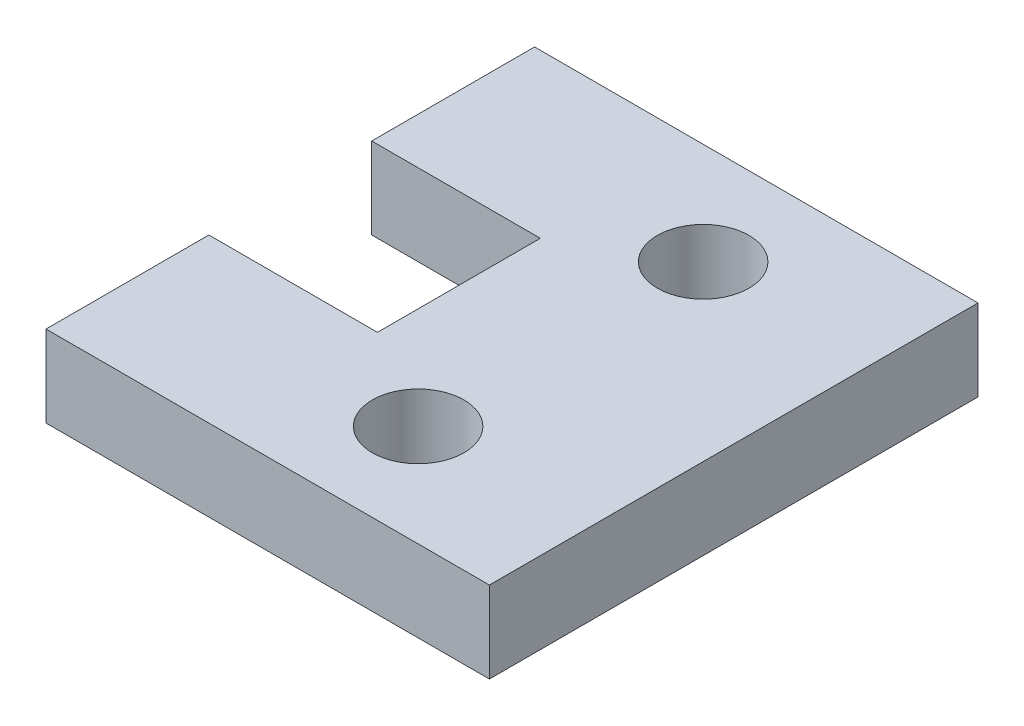
ISO-10303-21;
HEADER;
FILE_DESCRIPTION(('STEP AP214'),'2;1');
FILE_NAME('part.step','',(''),(''),'','','');
FILE_SCHEMA(('AUTOMOTIVE_DESIGN { 1 0 10303 214 1 1 1 1 }'));
ENDSEC;
DATA;
#1=APPLICATION_CONTEXT('core data for automotive mechanical design processes');
#2=APPLICATION_PROTOCOL_DEFINITION('international standard','automotive_design',2000,#1);
#3=PRODUCT_CONTEXT('',#1,'mechanical');
#4=PRODUCT('Part','Part','',(#3));
#5=PRODUCT_RELATED_PRODUCT_CATEGORY('part','',(#4));
#6=PRODUCT_DEFINITION_FORMATION('','',#4);
#7=PRODUCT_DEFINITION_CONTEXT('part definition',#1,'design');
#8=PRODUCT_DEFINITION('design','',#6,#7);
#9=PRODUCT_DEFINITION_SHAPE('','',#8);
#10=(LENGTH_UNIT() NAMED_UNIT(*) SI_UNIT(.MILLI.,.METRE.));
#11=(NAMED_UNIT(*) PLANE_ANGLE_UNIT() SI_UNIT($,.RADIAN.));
#12=(NAMED_UNIT(*) SI_UNIT($,.STERADIAN.) SOLID_ANGLE_UNIT());
#13=UNCERTAINTY_MEASURE_WITH_UNIT(LENGTH_MEASURE(1.E-05),#10,'distance_accuracy_value','');
#14=(GEOMETRIC_REPRESENTATION_CONTEXT(3) GLOBAL_UNCERTAINTY_ASSIGNED_CONTEXT((#13)) GLOBAL_UNIT_ASSIGNED_CONTEXT((#10,
#11,#12)) REPRESENTATION_CONTEXT('',''));
#15=CARTESIAN_POINT('',(0.,0.,0.));
#16=DIRECTION('',(0.,0.,1.));
#17=DIRECTION('',(1.,0.,0.));
#18=AXIS2_PLACEMENT_3D('',#15,#16,#17);
#19=CARTESIAN_POINT('',(-5.,4.,0.));
#20=DIRECTION('',(-1.,0.,0.));
#21=DIRECTION('',(0.,0.,1.));
#22=AXIS2_PLACEMENT_3D('',#19,#20,#21);
#23=PLANE('',#22);
#24=DIRECTION('',(0.,0.,-1.));
#25=VECTOR('',#24,1.);
#26=CARTESIAN_POINT('',(-5.,0.,0.));
#27=LINE('',#26,#25);
#28=CARTESIAN_POINT('',(-5.,0.,4.));
#29=VERTEX_POINT('',#28);
#30=CARTESIAN_POINT('',(-5.,0.,-4.));
#31=VERTEX_POINT('',#30);
#32=EDGE_CURVE('E155',#29,#31,#27,.T.);
#33=ORIENTED_EDGE('',*,*,#32,.F.);
#34=DIRECTION('',(0.,-1.,0.));
#35=VECTOR('',#34,1.);
#36=CARTESIAN_POINT('',(-5.,4.,4.));
#37=LINE('',#36,#35);
#38=CARTESIAN_POINT('',(-5.,4.,4.));
#39=VERTEX_POINT('',#38);
#40=EDGE_CURVE('E11',#39,#29,#37,.T.);
#41=ORIENTED_EDGE('',*,*,#40,.F.);
#42=DIRECTION('',(0.,0.,-1.));
#43=VECTOR('',#42,1.);
#44=CARTESIAN_POINT('',(-5.,4.,0.));
#45=LINE('',#44,#43);
#46=CARTESIAN_POINT('',(-5.,4.,-4.));
#47=VERTEX_POINT('',#46);
#48=EDGE_CURVE('E185',#39,#47,#45,.T.);
#49=ORIENTED_EDGE('',*,*,#48,.T.);
#50=DIRECTION('',(0.,-1.,0.));
#51=VECTOR('',#50,1.);
#52=CARTESIAN_POINT('',(-5.,4.,-4.));
#53=LINE('',#52,#51);
#54=EDGE_CURVE('E100',#47,#31,#53,.T.);
#55=ORIENTED_EDGE('',*,*,#54,.T.);
#56=EDGE_LOOP('',(#33,#41,#49,#55));
#57=FACE_BOUND('',#56,.T.);
#58=ADVANCED_FACE('F41',(#57),#23,.T.);
#59=CARTESIAN_POINT('',(0.,4.,4.));
#60=DIRECTION('',(0.,0.,1.));
#61=DIRECTION('',(1.,0.,0.));
#62=AXIS2_PLACEMENT_3D('',#59,#60,#61);
#63=PLANE('',#62);
#64=DIRECTION('',(-1.,0.,0.));
#65=VECTOR('',#64,1.);
#66=CARTESIAN_POINT('',(0.,0.,4.));
#67=LINE('',#66,#65);
#68=CARTESIAN_POINT('',(-13.2799459906607,0.,4.));
#69=VERTEX_POINT('',#68);
#70=EDGE_CURVE('E158',#29,#69,#67,.T.);
#71=ORIENTED_EDGE('',*,*,#70,.T.);
#72=DIRECTION('',(0.,-1.,0.));
#73=VECTOR('',#72,1.);
#74=CARTESIAN_POINT('',(-13.2799459906607,4.,4.));
#75=LINE('',#74,#73);
#76=CARTESIAN_POINT('',(-13.2799459906607,4.,4.));
#77=VERTEX_POINT('',#76);
#78=EDGE_CURVE('E49',#77,#69,#75,.T.);
#79=ORIENTED_EDGE('',*,*,#78,.F.);
#80=DIRECTION('',(-1.,0.,0.));
#81=VECTOR('',#80,1.);
#82=CARTESIAN_POINT('',(0.,4.,4.));
#83=LINE('',#82,#81);
#84=EDGE_CURVE('E221',#39,#77,#83,.T.);
#85=ORIENTED_EDGE('',*,*,#84,.F.);
#86=ORIENTED_EDGE('',*,*,#40,.T.);
#87=EDGE_LOOP('',(#71,#79,#85,#86));
#88=FACE_BOUND('',#87,.T.);
#89=ADVANCED_FACE('F226',(#88),#63,.F.);
#90=CARTESIAN_POINT('',(-13.2799459906607,4.,0.));
#91=DIRECTION('',(1.,0.,0.));
#92=DIRECTION('',(0.,0.,-1.));
#93=AXIS2_PLACEMENT_3D('',#90,#91,#92);
#94=PLANE('',#93);
#95=DIRECTION('',(0.,0.,1.));
#96=VECTOR('',#95,1.);
#97=CARTESIAN_POINT('',(-13.2799459906607,0.,0.));
#98=LINE('',#97,#96);
#99=CARTESIAN_POINT('',(-13.2799459906607,0.,12.));
#100=VERTEX_POINT('',#99);
#101=EDGE_CURVE('E160',#69,#100,#98,.T.);
#102=ORIENTED_EDGE('',*,*,#101,.T.);
#103=DIRECTION('',(0.,-1.,0.));
#104=VECTOR('',#103,1.);
#105=CARTESIAN_POINT('',(-13.2799459906607,4.,12.));
#106=LINE('',#105,#104);
#107=CARTESIAN_POINT('',(-13.2799459906607,4.,12.));
#108=VERTEX_POINT('',#107);
#109=EDGE_CURVE('E194',#108,#100,#106,.T.);
#110=ORIENTED_EDGE('',*,*,#109,.F.);
#111=DIRECTION('',(0.,0.,1.));
#112=VECTOR('',#111,1.);
#113=CARTESIAN_POINT('',(-13.2799459906607,4.,0.));
#114=LINE('',#113,#112);
#115=EDGE_CURVE('E204',#77,#108,#114,.T.);
#116=ORIENTED_EDGE('',*,*,#115,.F.);
#117=ORIENTED_EDGE('',*,*,#78,.T.);
#118=EDGE_LOOP('',(#102,#110,#116,#117));
#119=FACE_BOUND('',#118,.T.);
#120=ADVANCED_FACE('F202',(#119),#94,.F.);
#121=CARTESIAN_POINT('',(0.,4.,12.));
#122=DIRECTION('',(0.,0.,-1.));
#123=DIRECTION('',(-1.,0.,0.));
#124=AXIS2_PLACEMENT_3D('',#121,#122,#123);
#125=PLANE('',#124);
#126=DIRECTION('',(1.,0.,0.));
#127=VECTOR('',#126,1.);
#128=CARTESIAN_POINT('',(0.,0.,12.));
#129=LINE('',#128,#127);
#130=CARTESIAN_POINT('',(8.5,0.,12.));
#131=VERTEX_POINT('',#130);
#132=EDGE_CURVE('E163',#100,#131,#129,.T.);
#133=ORIENTED_EDGE('',*,*,#132,.T.);
#134=DIRECTION('',(0.,-1.,0.));
#135=VECTOR('',#134,1.);
#136=CARTESIAN_POINT('',(8.5,4.,12.));
#137=LINE('',#136,#135);
#138=CARTESIAN_POINT('',(8.5,4.,12.));
#139=VERTEX_POINT('',#138);
#140=EDGE_CURVE('E191',#139,#131,#137,.T.);
#141=ORIENTED_EDGE('',*,*,#140,.F.);
#142=DIRECTION('',(1.,0.,0.));
#143=VECTOR('',#142,1.);
#144=CARTESIAN_POINT('',(0.,4.,12.));
#145=LINE('',#144,#143);
#146=EDGE_CURVE('E216',#108,#139,#145,.T.);
#147=ORIENTED_EDGE('',*,*,#146,.F.);
#148=ORIENTED_EDGE('',*,*,#109,.T.);
#149=EDGE_LOOP('',(#133,#141,#147,#148));
#150=FACE_BOUND('',#149,.T.);
#151=ADVANCED_FACE('F214',(#150),#125,.F.);
#152=CARTESIAN_POINT('',(8.5,4.,0.));
#153=DIRECTION('',(1.,0.,0.));
#154=DIRECTION('',(0.,0.,-1.));
#155=AXIS2_PLACEMENT_3D('',#152,#153,#154);
#156=PLANE('',#155);
#157=DIRECTION('',(0.,0.,1.));
#158=VECTOR('',#157,1.);
#159=CARTESIAN_POINT('',(8.5,0.,0.));
#160=LINE('',#159,#158);
#161=CARTESIAN_POINT('',(8.5,0.,-12.));
#162=VERTEX_POINT('',#161);
#163=EDGE_CURVE('E166',#162,#131,#160,.T.);
#164=ORIENTED_EDGE('',*,*,#163,.F.);
#165=DIRECTION('',(0.,-1.,0.));
#166=VECTOR('',#165,1.);
#167=CARTESIAN_POINT('',(8.5,4.,-12.));
#168=LINE('',#167,#166);
#169=CARTESIAN_POINT('',(8.5,4.,-12.));
#170=VERTEX_POINT('',#169);
#171=EDGE_CURVE('E137',#170,#162,#168,.T.);
#172=ORIENTED_EDGE('',*,*,#171,.F.);
#173=DIRECTION('',(0.,0.,1.));
#174=VECTOR('',#173,1.);
#175=CARTESIAN_POINT('',(8.5,4.,0.));
#176=LINE('',#175,#174);
#177=EDGE_CURVE('E128',#170,#139,#176,.T.);
#178=ORIENTED_EDGE('',*,*,#177,.T.);
#179=ORIENTED_EDGE('',*,*,#140,.T.);
#180=EDGE_LOOP('',(#164,#172,#178,#179));
#181=FACE_BOUND('',#180,.T.);
#182=ADVANCED_FACE('F236',(#181),#156,.T.);
#183=CARTESIAN_POINT('',(0.,4.,-12.));
#184=DIRECTION('',(0.,0.,1.));
#185=DIRECTION('',(1.,0.,0.));
#186=AXIS2_PLACEMENT_3D('',#183,#184,#185);
#187=PLANE('',#186);
#188=DIRECTION('',(-1.,0.,0.));
#189=VECTOR('',#188,1.);
#190=CARTESIAN_POINT('',(0.,0.,-12.));
#191=LINE('',#190,#189);
#192=CARTESIAN_POINT('',(-13.2799459906607,0.,-12.));
#193=VERTEX_POINT('',#192);
#194=EDGE_CURVE('E135',#162,#193,#191,.T.);
#195=ORIENTED_EDGE('',*,*,#194,.T.);
#196=DIRECTION('',(0.,-1.,0.));
#197=VECTOR('',#196,1.);
#198=CARTESIAN_POINT('',(-13.2799459906607,4.,-12.));
#199=LINE('',#198,#197);
#200=CARTESIAN_POINT('',(-13.2799459906607,4.,-12.));
#201=VERTEX_POINT('',#200);
#202=EDGE_CURVE('E132',#201,#193,#199,.T.);
#203=ORIENTED_EDGE('',*,*,#202,.F.);
#204=DIRECTION('',(-1.,0.,0.));
#205=VECTOR('',#204,1.);
#206=CARTESIAN_POINT('',(0.,4.,-12.));
#207=LINE('',#206,#205);
#208=EDGE_CURVE('E121',#170,#201,#207,.T.);
#209=ORIENTED_EDGE('',*,*,#208,.F.);
#210=ORIENTED_EDGE('',*,*,#171,.T.);
#211=EDGE_LOOP('',(#195,#203,#209,#210));
#212=FACE_BOUND('',#211,.T.);
#213=ADVANCED_FACE('F133',(#212),#187,.F.);
#214=CARTESIAN_POINT('',(-13.2799459906607,4.,0.));
#215=DIRECTION('',(1.,0.,0.));
#216=DIRECTION('',(0.,0.,-1.));
#217=AXIS2_PLACEMENT_3D('',#214,#215,#216);
#218=PLANE('',#217);
#219=DIRECTION('',(0.,0.,1.));
#220=VECTOR('',#219,1.);
#221=CARTESIAN_POINT('',(-13.2799459906607,0.,0.));
#222=LINE('',#221,#220);
#223=CARTESIAN_POINT('',(-13.2799459906607,0.,-4.));
#224=VERTEX_POINT('',#223);
#225=EDGE_CURVE('E93',#193,#224,#222,.T.);
#226=ORIENTED_EDGE('',*,*,#225,.T.);
#227=DIRECTION('',(0.,-1.,0.));
#228=VECTOR('',#227,1.);
#229=CARTESIAN_POINT('',(-13.2799459906607,4.,-4.));
#230=LINE('',#229,#228);
#231=CARTESIAN_POINT('',(-13.2799459906607,4.,-4.));
#232=VERTEX_POINT('',#231);
#233=EDGE_CURVE('E138',#232,#224,#230,.T.);
#234=ORIENTED_EDGE('',*,*,#233,.F.);
#235=DIRECTION('',(0.,0.,1.));
#236=VECTOR('',#235,1.);
#237=CARTESIAN_POINT('',(-13.2799459906607,4.,0.));
#238=LINE('',#237,#236);
#239=EDGE_CURVE('E126',#201,#232,#238,.T.);
#240=ORIENTED_EDGE('',*,*,#239,.F.);
#241=ORIENTED_EDGE('',*,*,#202,.T.);
#242=EDGE_LOOP('',(#226,#234,#240,#241));
#243=FACE_BOUND('',#242,.T.);
#244=ADVANCED_FACE('F140',(#243),#218,.F.);
#245=CARTESIAN_POINT('',(0.,4.,-7.00000000000125));
#246=DIRECTION('',(0.,-1.,0.));
#247=DIRECTION('',(0.,0.,-1.));
#248=AXIS2_PLACEMENT_3D('',#245,#246,#247);
#249=CYLINDRICAL_SURFACE('',#248,2.25);
#250=CARTESIAN_POINT('',(0.,4.,-7.00000000000125));
#251=DIRECTION('',(0.,1.,0.));
#252=DIRECTION('',(0.,0.,1.));
#253=AXIS2_PLACEMENT_3D('',#250,#251,#252);
#254=CIRCLE('',#253,2.25);
#255=CARTESIAN_POINT('',(0.,4.,-4.75000000000125));
#256=VERTEX_POINT('',#255);
#257=EDGE_CURVE('E145',#256,#256,#254,.T.);
#258=ORIENTED_EDGE('',*,*,#257,.T.);
#259=EDGE_LOOP('',(#258));
#260=FACE_BOUND('',#259,.T.);
#261=CARTESIAN_POINT('',(0.,0.,-7.00000000000125));
#262=DIRECTION('',(0.,1.,0.));
#263=DIRECTION('',(0.,0.,1.));
#264=AXIS2_PLACEMENT_3D('',#261,#262,#263);
#265=CIRCLE('',#264,2.25);
#266=CARTESIAN_POINT('',(0.,0.,-4.75000000000125));
#267=VERTEX_POINT('',#266);
#268=EDGE_CURVE('E177',#267,#267,#265,.T.);
#269=ORIENTED_EDGE('',*,*,#268,.F.);
#270=EDGE_LOOP('',(#269));
#271=FACE_BOUND('',#270,.T.);
#272=ADVANCED_FACE('F244',(#260,#271),#249,.F.);
#273=CARTESIAN_POINT('',(0.,4.,-4.));
#274=DIRECTION('',(0.,0.,-1.));
#275=DIRECTION('',(-1.,0.,0.));
#276=AXIS2_PLACEMENT_3D('',#273,#274,#275);
#277=PLANE('',#276);
#278=DIRECTION('',(1.,0.,0.));
#279=VECTOR('',#278,1.);
#280=CARTESIAN_POINT('',(0.,0.,-4.));
#281=LINE('',#280,#279);
#282=EDGE_CURVE('E174',#224,#31,#281,.T.);
#283=ORIENTED_EDGE('',*,*,#282,.T.);
#284=ORIENTED_EDGE('',*,*,#54,.F.);
#285=DIRECTION('',(1.,0.,0.));
#286=VECTOR('',#285,1.);
#287=CARTESIAN_POINT('',(0.,4.,-4.));
#288=LINE('',#287,#286);
#289=EDGE_CURVE('E60',#232,#47,#288,.T.);
#290=ORIENTED_EDGE('',*,*,#289,.F.);
#291=ORIENTED_EDGE('',*,*,#233,.T.);
#292=EDGE_LOOP('',(#283,#284,#290,#291));
#293=FACE_BOUND('',#292,.T.);
#294=ADVANCED_FACE('F245',(#293),#277,.F.);
#295=CARTESIAN_POINT('',(0.,4.,6.99999999999875));
#296=DIRECTION('',(0.,-1.,0.));
#297=DIRECTION('',(0.,0.,-1.));
#298=AXIS2_PLACEMENT_3D('',#295,#296,#297);
#299=CYLINDRICAL_SURFACE('',#298,2.25);
#300=CARTESIAN_POINT('',(0.,4.,6.99999999999875));
#301=DIRECTION('',(0.,1.,0.));
#302=DIRECTION('',(0.,0.,1.));
#303=AXIS2_PLACEMENT_3D('',#300,#301,#302);
#304=CIRCLE('',#303,2.25);
#305=CARTESIAN_POINT('',(0.,4.,9.24999999999875));
#306=VERTEX_POINT('',#305);
#307=EDGE_CURVE('E152',#306,#306,#304,.T.);
#308=ORIENTED_EDGE('',*,*,#307,.T.);
#309=EDGE_LOOP('',(#308));
#310=FACE_BOUND('',#309,.T.);
#311=CARTESIAN_POINT('',(0.,0.,6.99999999999875));
#312=DIRECTION('',(0.,1.,0.));
#313=DIRECTION('',(0.,0.,1.));
#314=AXIS2_PLACEMENT_3D('',#311,#312,#313);
#315=CIRCLE('',#314,2.25);
#316=CARTESIAN_POINT('',(0.,0.,9.24999999999875));
#317=VERTEX_POINT('',#316);
#318=EDGE_CURVE('E181',#317,#317,#315,.T.);
#319=ORIENTED_EDGE('',*,*,#318,.F.);
#320=EDGE_LOOP('',(#319));
#321=FACE_BOUND('',#320,.T.);
#322=ADVANCED_FACE('F248',(#310,#321),#299,.F.);
#323=CARTESIAN_POINT('',(0.,4.,0.));
#324=DIRECTION('',(0.,1.,0.));
#325=DIRECTION('',(0.,0.,1.));
#326=AXIS2_PLACEMENT_3D('',#323,#324,#325);
#327=PLANE('',#326);
#328=ORIENTED_EDGE('',*,*,#48,.F.);
#329=ORIENTED_EDGE('',*,*,#84,.T.);
#330=ORIENTED_EDGE('',*,*,#115,.T.);
#331=ORIENTED_EDGE('',*,*,#146,.T.);
#332=ORIENTED_EDGE('',*,*,#177,.F.);
#333=ORIENTED_EDGE('',*,*,#208,.T.);
#334=ORIENTED_EDGE('',*,*,#239,.T.);
#335=ORIENTED_EDGE('',*,*,#289,.T.);
#336=EDGE_LOOP('',(#328,#329,#330,#331,#332,#333,#334,#335));
#337=FACE_BOUND('',#336,.T.);
#338=ORIENTED_EDGE('',*,*,#257,.F.);
#339=EDGE_LOOP('',(#338));
#340=FACE_BOUND('',#339,.T.);
#341=ORIENTED_EDGE('',*,*,#307,.F.);
#342=EDGE_LOOP('',(#341));
#343=FACE_BOUND('',#342,.T.);
#344=ADVANCED_FACE('F123',(#337,#340,#343),#327,.T.);
#345=CARTESIAN_POINT('',(0.,0.,0.));
#346=DIRECTION('',(0.,1.,0.));
#347=DIRECTION('',(0.,0.,1.));
#348=AXIS2_PLACEMENT_3D('',#345,#346,#347);
#349=PLANE('',#348);
#350=ORIENTED_EDGE('',*,*,#32,.T.);
#351=ORIENTED_EDGE('',*,*,#282,.F.);
#352=ORIENTED_EDGE('',*,*,#225,.F.);
#353=ORIENTED_EDGE('',*,*,#194,.F.);
#354=ORIENTED_EDGE('',*,*,#163,.T.);
#355=ORIENTED_EDGE('',*,*,#132,.F.);
#356=ORIENTED_EDGE('',*,*,#101,.F.);
#357=ORIENTED_EDGE('',*,*,#70,.F.);
#358=EDGE_LOOP('',(#350,#351,#352,#353,#354,#355,#356,#357));
#359=FACE_BOUND('',#358,.T.);
#360=ORIENTED_EDGE('',*,*,#268,.T.);
#361=EDGE_LOOP('',(#360));
#362=FACE_BOUND('',#361,.T.);
#363=ORIENTED_EDGE('',*,*,#318,.T.);
#364=EDGE_LOOP('',(#363));
#365=FACE_BOUND('',#364,.T.);
#366=ADVANCED_FACE('F209',(#359,#362,#365),#349,.F.);
#367=CLOSED_SHELL('',(#58,#89,#120,#151,#182,#213,#244,#272,#294,#322,#344,#366));
#368=MANIFOLD_SOLID_BREP('B2',#367);
#369=ADVANCED_BREP_SHAPE_REPRESENTATION('',(#18,#368),#14);
#370=SHAPE_DEFINITION_REPRESENTATION(#9,#369);
ENDSEC;
END-ISO-10303-21;
